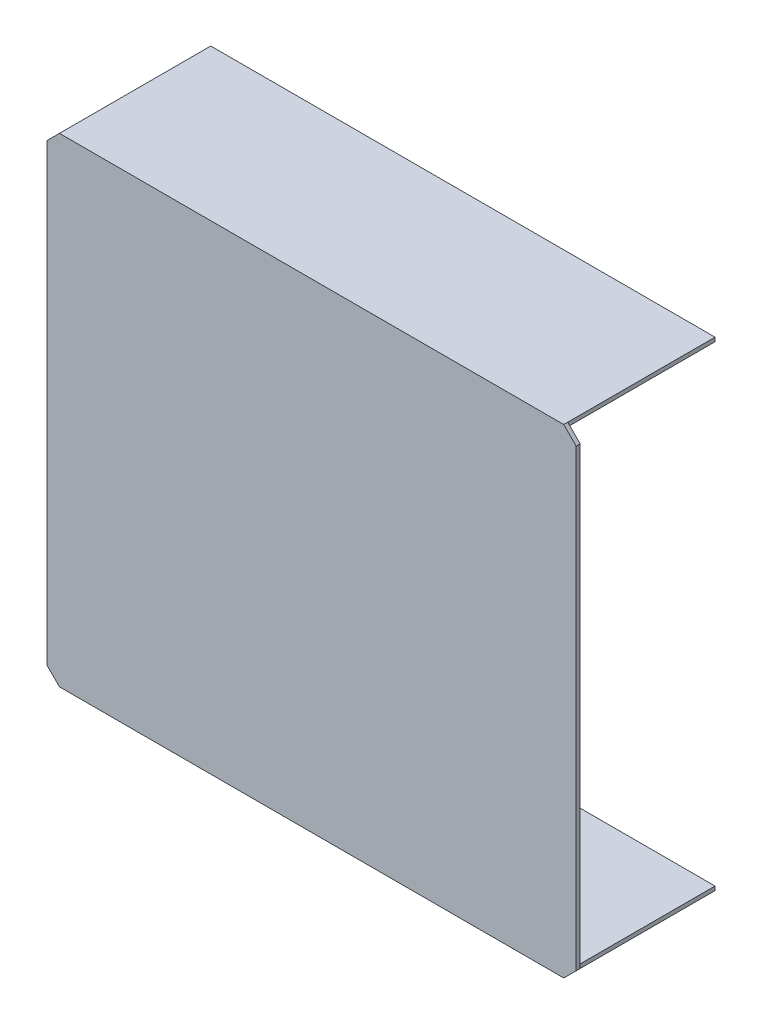
ISO-10303-21;
HEADER;
FILE_DESCRIPTION(('STEP AP214'),'2;1');
FILE_NAME('part.step','',(''),(''),'','','');
FILE_SCHEMA(('AUTOMOTIVE_DESIGN { 1 0 10303 214 1 1 1 1 }'));
ENDSEC;
DATA;
#1=APPLICATION_CONTEXT('core data for automotive mechanical design processes');
#2=APPLICATION_PROTOCOL_DEFINITION('international standard','automotive_design',2000,#1);
#3=PRODUCT_CONTEXT('',#1,'mechanical');
#4=PRODUCT('Part','Part','',(#3));
#5=PRODUCT_RELATED_PRODUCT_CATEGORY('part','',(#4));
#6=PRODUCT_DEFINITION_FORMATION('','',#4);
#7=PRODUCT_DEFINITION_CONTEXT('part definition',#1,'design');
#8=PRODUCT_DEFINITION('design','',#6,#7);
#9=PRODUCT_DEFINITION_SHAPE('','',#8);
#10=(LENGTH_UNIT() NAMED_UNIT(*) SI_UNIT(.MILLI.,.METRE.));
#11=(NAMED_UNIT(*) PLANE_ANGLE_UNIT() SI_UNIT($,.RADIAN.));
#12=(NAMED_UNIT(*) SI_UNIT($,.STERADIAN.) SOLID_ANGLE_UNIT());
#13=UNCERTAINTY_MEASURE_WITH_UNIT(LENGTH_MEASURE(1.E-05),#10,'distance_accuracy_value','');
#14=(GEOMETRIC_REPRESENTATION_CONTEXT(3) GLOBAL_UNCERTAINTY_ASSIGNED_CONTEXT((#13)) GLOBAL_UNIT_ASSIGNED_CONTEXT((#10,
#11,#12)) REPRESENTATION_CONTEXT('',''));
#15=CARTESIAN_POINT('',(0.,0.,0.));
#16=DIRECTION('',(0.,0.,1.));
#17=DIRECTION('',(1.,0.,0.));
#18=AXIS2_PLACEMENT_3D('',#15,#16,#17);
#19=CARTESIAN_POINT('',(-106.,-91.,87.6));
#20=DIRECTION('',(0.707106781186549,0.707106781186547,0.));
#21=DIRECTION('',(-0.707106781186547,0.707106781186549,0.));
#22=AXIS2_PLACEMENT_3D('',#19,#20,#21);
#23=PLANE('',#22);
#24=DIRECTION('',(0.707106781186546,-0.707106781186548,0.));
#25=VECTOR('',#24,1.);
#26=CARTESIAN_POINT('',(-106.,-91.,86.));
#27=LINE('',#26,#25);
#28=CARTESIAN_POINT('',(-106.,-91.,86.));
#29=VERTEX_POINT('',#28);
#30=CARTESIAN_POINT('',(-101.,-96.,86.));
#31=VERTEX_POINT('',#30);
#32=EDGE_CURVE('E141',#29,#31,#27,.T.);
#33=ORIENTED_EDGE('',*,*,#32,.T.);
#34=DIRECTION('',(0.,0.,-1.));
#35=VECTOR('',#34,1.);
#36=CARTESIAN_POINT('',(-101.,-96.,87.6));
#37=LINE('',#36,#35);
#38=CARTESIAN_POINT('',(-101.,-96.,87.6));
#39=VERTEX_POINT('',#38);
#40=EDGE_CURVE('E11',#39,#31,#37,.T.);
#41=ORIENTED_EDGE('',*,*,#40,.F.);
#42=DIRECTION('',(0.707106781186546,-0.707106781186548,0.));
#43=VECTOR('',#42,1.);
#44=CARTESIAN_POINT('',(-106.,-91.,87.6));
#45=LINE('',#44,#43);
#46=CARTESIAN_POINT('',(-106.,-91.,87.6));
#47=VERTEX_POINT('',#46);
#48=EDGE_CURVE('E160',#47,#39,#45,.T.);
#49=ORIENTED_EDGE('',*,*,#48,.F.);
#50=DIRECTION('',(0.,0.,-1.));
#51=VECTOR('',#50,1.);
#52=CARTESIAN_POINT('',(-106.,-91.,87.6));
#53=LINE('',#52,#51);
#54=EDGE_CURVE('E138',#47,#29,#53,.T.);
#55=ORIENTED_EDGE('',*,*,#54,.T.);
#56=EDGE_LOOP('',(#33,#41,#49,#55));
#57=FACE_BOUND('',#56,.T.);
#58=ADVANCED_FACE('F41',(#57),#23,.F.);
#59=CARTESIAN_POINT('',(-101.,-96.,87.6));
#60=DIRECTION('',(0.,1.,0.));
#61=DIRECTION('',(0.,0.,1.));
#62=AXIS2_PLACEMENT_3D('',#59,#60,#61);
#63=PLANE('',#62);
#64=ORIENTED_EDGE('',*,*,#40,.T.);
#65=DIRECTION('',(0.,0.,-1.));
#66=VECTOR('',#65,1.);
#67=CARTESIAN_POINT('',(-101.,-96.,86.));
#68=LINE('',#67,#66);
#69=CARTESIAN_POINT('',(-101.,-96.,27.));
#70=VERTEX_POINT('',#69);
#71=EDGE_CURVE('E225',#31,#70,#68,.T.);
#72=ORIENTED_EDGE('',*,*,#71,.T.);
#73=DIRECTION('',(1.,0.,0.));
#74=VECTOR('',#73,1.);
#75=CARTESIAN_POINT('',(-101.,-96.,27.));
#76=LINE('',#75,#74);
#77=CARTESIAN_POINT('',(101.,-96.,27.));
#78=VERTEX_POINT('',#77);
#79=EDGE_CURVE('E210',#70,#78,#76,.T.);
#80=ORIENTED_EDGE('',*,*,#79,.T.);
#81=DIRECTION('',(0.,0.,-1.));
#82=VECTOR('',#81,1.);
#83=CARTESIAN_POINT('',(101.,-96.,86.));
#84=LINE('',#83,#82);
#85=CARTESIAN_POINT('',(101.,-96.,86.));
#86=VERTEX_POINT('',#85);
#87=EDGE_CURVE('E218',#86,#78,#84,.T.);
#88=ORIENTED_EDGE('',*,*,#87,.F.);
#89=DIRECTION('',(0.,0.,-1.));
#90=VECTOR('',#89,1.);
#91=CARTESIAN_POINT('',(101.,-96.,87.6));
#92=LINE('',#91,#90);
#93=CARTESIAN_POINT('',(101.,-96.,87.6));
#94=VERTEX_POINT('',#93);
#95=EDGE_CURVE('E48',#94,#86,#92,.T.);
#96=ORIENTED_EDGE('',*,*,#95,.F.);
#97=DIRECTION('',(1.,0.,0.));
#98=VECTOR('',#97,1.);
#99=CARTESIAN_POINT('',(-101.,-96.,87.6));
#100=LINE('',#99,#98);
#101=EDGE_CURVE('E96',#39,#94,#100,.T.);
#102=ORIENTED_EDGE('',*,*,#101,.F.);
#103=EDGE_LOOP('',(#64,#72,#80,#88,#96,#102));
#104=FACE_BOUND('',#103,.T.);
#105=ADVANCED_FACE('F292',(#104),#63,.F.);
#106=CARTESIAN_POINT('',(101.,-96.,87.6));
#107=DIRECTION('',(-0.707106781186549,0.707106781186547,0.));
#108=DIRECTION('',(-0.707106781186547,-0.707106781186549,0.));
#109=AXIS2_PLACEMENT_3D('',#106,#107,#108);
#110=PLANE('',#109);
#111=DIRECTION('',(0.707106781186546,0.707106781186548,0.));
#112=VECTOR('',#111,1.);
#113=CARTESIAN_POINT('',(101.,-96.,86.));
#114=LINE('',#113,#112);
#115=CARTESIAN_POINT('',(106.,-91.,86.));
#116=VERTEX_POINT('',#115);
#117=EDGE_CURVE('E148',#86,#116,#114,.T.);
#118=ORIENTED_EDGE('',*,*,#117,.T.);
#119=DIRECTION('',(0.,0.,-1.));
#120=VECTOR('',#119,1.);
#121=CARTESIAN_POINT('',(106.,-91.,87.6));
#122=LINE('',#121,#120);
#123=CARTESIAN_POINT('',(106.,-91.,87.6));
#124=VERTEX_POINT('',#123);
#125=EDGE_CURVE('E163',#124,#116,#122,.T.);
#126=ORIENTED_EDGE('',*,*,#125,.F.);
#127=DIRECTION('',(0.707106781186546,0.707106781186548,0.));
#128=VECTOR('',#127,1.);
#129=CARTESIAN_POINT('',(101.,-96.,87.6));
#130=LINE('',#129,#128);
#131=EDGE_CURVE('E174',#94,#124,#130,.T.);
#132=ORIENTED_EDGE('',*,*,#131,.F.);
#133=ORIENTED_EDGE('',*,*,#95,.T.);
#134=EDGE_LOOP('',(#118,#126,#132,#133));
#135=FACE_BOUND('',#134,.T.);
#136=ADVANCED_FACE('F172',(#135),#110,.F.);
#137=CARTESIAN_POINT('',(106.,-91.,87.6));
#138=DIRECTION('',(-1.,0.,0.));
#139=DIRECTION('',(0.,0.,1.));
#140=AXIS2_PLACEMENT_3D('',#137,#138,#139);
#141=PLANE('',#140);
#142=DIRECTION('',(0.,1.,0.));
#143=VECTOR('',#142,1.);
#144=CARTESIAN_POINT('',(106.,-91.,86.));
#145=LINE('',#144,#143);
#146=CARTESIAN_POINT('',(106.,91.,86.));
#147=VERTEX_POINT('',#146);
#148=EDGE_CURVE('E149',#116,#147,#145,.T.);
#149=ORIENTED_EDGE('',*,*,#148,.T.);
#150=DIRECTION('',(0.,0.,-1.));
#151=VECTOR('',#150,1.);
#152=CARTESIAN_POINT('',(106.,91.,87.6));
#153=LINE('',#152,#151);
#154=CARTESIAN_POINT('',(106.,91.,87.6));
#155=VERTEX_POINT('',#154);
#156=EDGE_CURVE('E161',#155,#147,#153,.T.);
#157=ORIENTED_EDGE('',*,*,#156,.F.);
#158=DIRECTION('',(0.,1.,0.));
#159=VECTOR('',#158,1.);
#160=CARTESIAN_POINT('',(106.,-91.,87.6));
#161=LINE('',#160,#159);
#162=EDGE_CURVE('E191',#124,#155,#161,.T.);
#163=ORIENTED_EDGE('',*,*,#162,.F.);
#164=ORIENTED_EDGE('',*,*,#125,.T.);
#165=EDGE_LOOP('',(#149,#157,#163,#164));
#166=FACE_BOUND('',#165,.T.);
#167=ADVANCED_FACE('F190',(#166),#141,.F.);
#168=CARTESIAN_POINT('',(106.,91.,87.6));
#169=DIRECTION('',(-0.707106781186549,-0.707106781186547,0.));
#170=DIRECTION('',(0.707106781186547,-0.707106781186549,0.));
#171=AXIS2_PLACEMENT_3D('',#168,#169,#170);
#172=PLANE('',#171);
#173=DIRECTION('',(-0.707106781186546,0.707106781186548,0.));
#174=VECTOR('',#173,1.);
#175=CARTESIAN_POINT('',(106.,91.,86.));
#176=LINE('',#175,#174);
#177=CARTESIAN_POINT('',(101.,96.,86.));
#178=VERTEX_POINT('',#177);
#179=EDGE_CURVE('E151',#147,#178,#176,.T.);
#180=ORIENTED_EDGE('',*,*,#179,.T.);
#181=DIRECTION('',(0.,0.,-1.));
#182=VECTOR('',#181,1.);
#183=CARTESIAN_POINT('',(101.,96.,87.6));
#184=LINE('',#183,#182);
#185=CARTESIAN_POINT('',(101.,96.,87.6));
#186=VERTEX_POINT('',#185);
#187=EDGE_CURVE('E131',#186,#178,#184,.T.);
#188=ORIENTED_EDGE('',*,*,#187,.F.);
#189=DIRECTION('',(-0.707106781186546,0.707106781186548,0.));
#190=VECTOR('',#189,1.);
#191=CARTESIAN_POINT('',(106.,91.,87.6));
#192=LINE('',#191,#190);
#193=EDGE_CURVE('E116',#155,#186,#192,.T.);
#194=ORIENTED_EDGE('',*,*,#193,.F.);
#195=ORIENTED_EDGE('',*,*,#156,.T.);
#196=EDGE_LOOP('',(#180,#188,#194,#195));
#197=FACE_BOUND('',#196,.T.);
#198=ADVANCED_FACE('F188',(#197),#172,.F.);
#199=CARTESIAN_POINT('',(101.,96.,87.6));
#200=DIRECTION('',(0.,-1.,0.));
#201=DIRECTION('',(0.,0.,-1.));
#202=AXIS2_PLACEMENT_3D('',#199,#200,#201);
#203=PLANE('',#202);
#204=ORIENTED_EDGE('',*,*,#187,.T.);
#205=DIRECTION('',(0.,0.,-1.));
#206=VECTOR('',#205,1.);
#207=CARTESIAN_POINT('',(101.,96.,86.));
#208=LINE('',#207,#206);
#209=CARTESIAN_POINT('',(101.,96.,27.));
#210=VERTEX_POINT('',#209);
#211=EDGE_CURVE('E228',#178,#210,#208,.T.);
#212=ORIENTED_EDGE('',*,*,#211,.T.);
#213=DIRECTION('',(-1.,0.,0.));
#214=VECTOR('',#213,1.);
#215=CARTESIAN_POINT('',(101.,96.,27.));
#216=LINE('',#215,#214);
#217=CARTESIAN_POINT('',(-101.,96.,27.));
#218=VERTEX_POINT('',#217);
#219=EDGE_CURVE('E235',#210,#218,#216,.T.);
#220=ORIENTED_EDGE('',*,*,#219,.T.);
#221=DIRECTION('',(0.,0.,-1.));
#222=VECTOR('',#221,1.);
#223=CARTESIAN_POINT('',(-101.,96.,86.));
#224=LINE('',#223,#222);
#225=CARTESIAN_POINT('',(-101.,96.,86.));
#226=VERTEX_POINT('',#225);
#227=EDGE_CURVE('E128',#226,#218,#224,.T.);
#228=ORIENTED_EDGE('',*,*,#227,.F.);
#229=DIRECTION('',(0.,0.,-1.));
#230=VECTOR('',#229,1.);
#231=CARTESIAN_POINT('',(-101.,96.,87.6));
#232=LINE('',#231,#230);
#233=CARTESIAN_POINT('',(-101.,96.,87.6));
#234=VERTEX_POINT('',#233);
#235=EDGE_CURVE('E127',#234,#226,#232,.T.);
#236=ORIENTED_EDGE('',*,*,#235,.F.);
#237=DIRECTION('',(-1.,0.,0.));
#238=VECTOR('',#237,1.);
#239=CARTESIAN_POINT('',(101.,96.,87.6));
#240=LINE('',#239,#238);
#241=EDGE_CURVE('E115',#186,#234,#240,.T.);
#242=ORIENTED_EDGE('',*,*,#241,.F.);
#243=EDGE_LOOP('',(#204,#212,#220,#228,#236,#242));
#244=FACE_BOUND('',#243,.T.);
#245=ADVANCED_FACE('F130',(#244),#203,.F.);
#246=CARTESIAN_POINT('',(-101.,96.,87.6));
#247=DIRECTION('',(0.707106781186549,-0.707106781186547,0.));
#248=DIRECTION('',(0.707106781186547,0.707106781186549,0.));
#249=AXIS2_PLACEMENT_3D('',#246,#247,#248);
#250=PLANE('',#249);
#251=DIRECTION('',(-0.707106781186546,-0.707106781186548,0.));
#252=VECTOR('',#251,1.);
#253=CARTESIAN_POINT('',(-101.,96.,86.));
#254=LINE('',#253,#252);
#255=CARTESIAN_POINT('',(-106.,91.,86.));
#256=VERTEX_POINT('',#255);
#257=EDGE_CURVE('E152',#226,#256,#254,.T.);
#258=ORIENTED_EDGE('',*,*,#257,.T.);
#259=DIRECTION('',(0.,0.,-1.));
#260=VECTOR('',#259,1.);
#261=CARTESIAN_POINT('',(-106.,91.,87.6));
#262=LINE('',#261,#260);
#263=CARTESIAN_POINT('',(-106.,91.,87.6));
#264=VERTEX_POINT('',#263);
#265=EDGE_CURVE('E133',#264,#256,#262,.T.);
#266=ORIENTED_EDGE('',*,*,#265,.F.);
#267=DIRECTION('',(-0.707106781186546,-0.707106781186548,0.));
#268=VECTOR('',#267,1.);
#269=CARTESIAN_POINT('',(-101.,96.,87.6));
#270=LINE('',#269,#268);
#271=EDGE_CURVE('E117',#234,#264,#270,.T.);
#272=ORIENTED_EDGE('',*,*,#271,.F.);
#273=ORIENTED_EDGE('',*,*,#235,.T.);
#274=EDGE_LOOP('',(#258,#266,#272,#273));
#275=FACE_BOUND('',#274,.T.);
#276=ADVANCED_FACE('F137',(#275),#250,.F.);
#277=CARTESIAN_POINT('',(-106.,91.,87.6));
#278=DIRECTION('',(1.,0.,0.));
#279=DIRECTION('',(0.,0.,-1.));
#280=AXIS2_PLACEMENT_3D('',#277,#278,#279);
#281=PLANE('',#280);
#282=DIRECTION('',(0.,-1.,0.));
#283=VECTOR('',#282,1.);
#284=CARTESIAN_POINT('',(-106.,91.,86.));
#285=LINE('',#284,#283);
#286=EDGE_CURVE('E86',#256,#29,#285,.T.);
#287=ORIENTED_EDGE('',*,*,#286,.T.);
#288=ORIENTED_EDGE('',*,*,#54,.F.);
#289=DIRECTION('',(0.,-1.,0.));
#290=VECTOR('',#289,1.);
#291=CARTESIAN_POINT('',(-106.,91.,87.6));
#292=LINE('',#291,#290);
#293=EDGE_CURVE('E61',#264,#47,#292,.T.);
#294=ORIENTED_EDGE('',*,*,#293,.F.);
#295=ORIENTED_EDGE('',*,*,#265,.T.);
#296=EDGE_LOOP('',(#287,#288,#294,#295));
#297=FACE_BOUND('',#296,.T.);
#298=ADVANCED_FACE('F294',(#297),#281,.F.);
#299=CARTESIAN_POINT('',(0.,0.,87.6));
#300=DIRECTION('',(0.,0.,1.));
#301=DIRECTION('',(1.,0.,0.));
#302=AXIS2_PLACEMENT_3D('',#299,#300,#301);
#303=PLANE('',#302);
#304=ORIENTED_EDGE('',*,*,#48,.T.);
#305=ORIENTED_EDGE('',*,*,#101,.T.);
#306=ORIENTED_EDGE('',*,*,#131,.T.);
#307=ORIENTED_EDGE('',*,*,#162,.T.);
#308=ORIENTED_EDGE('',*,*,#193,.T.);
#309=ORIENTED_EDGE('',*,*,#241,.T.);
#310=ORIENTED_EDGE('',*,*,#271,.T.);
#311=ORIENTED_EDGE('',*,*,#293,.T.);
#312=EDGE_LOOP('',(#304,#305,#306,#307,#308,#309,#310,#311));
#313=FACE_BOUND('',#312,.T.);
#314=ADVANCED_FACE('F111',(#313),#303,.T.);
#315=CARTESIAN_POINT('',(0.,0.,86.));
#316=DIRECTION('',(0.,0.,1.));
#317=DIRECTION('',(1.,0.,0.));
#318=AXIS2_PLACEMENT_3D('',#315,#316,#317);
#319=PLANE('',#318);
#320=ORIENTED_EDGE('',*,*,#257,.F.);
#321=DIRECTION('',(0.,-1.,0.));
#322=VECTOR('',#321,1.);
#323=CARTESIAN_POINT('',(-101.,96.,86.));
#324=LINE('',#323,#322);
#325=CARTESIAN_POINT('',(-101.,94.4,86.));
#326=VERTEX_POINT('',#325);
#327=EDGE_CURVE('E240',#226,#326,#324,.T.);
#328=ORIENTED_EDGE('',*,*,#327,.T.);
#329=DIRECTION('',(1.,0.,0.));
#330=VECTOR('',#329,1.);
#331=CARTESIAN_POINT('',(-101.,94.4,86.));
#332=LINE('',#331,#330);
#333=CARTESIAN_POINT('',(101.,94.4,86.));
#334=VERTEX_POINT('',#333);
#335=EDGE_CURVE('E247',#326,#334,#332,.T.);
#336=ORIENTED_EDGE('',*,*,#335,.T.);
#337=DIRECTION('',(0.,1.,0.));
#338=VECTOR('',#337,1.);
#339=CARTESIAN_POINT('',(101.,94.4,86.));
#340=LINE('',#339,#338);
#341=EDGE_CURVE('E233',#334,#178,#340,.T.);
#342=ORIENTED_EDGE('',*,*,#341,.T.);
#343=ORIENTED_EDGE('',*,*,#179,.F.);
#344=ORIENTED_EDGE('',*,*,#148,.F.);
#345=ORIENTED_EDGE('',*,*,#117,.F.);
#346=DIRECTION('',(0.,1.,0.));
#347=VECTOR('',#346,1.);
#348=CARTESIAN_POINT('',(101.,-96.,86.));
#349=LINE('',#348,#347);
#350=CARTESIAN_POINT('',(101.,-94.4,86.));
#351=VERTEX_POINT('',#350);
#352=EDGE_CURVE('E185',#86,#351,#349,.T.);
#353=ORIENTED_EDGE('',*,*,#352,.T.);
#354=DIRECTION('',(-1.,0.,0.));
#355=VECTOR('',#354,1.);
#356=CARTESIAN_POINT('',(101.,-94.4,86.));
#357=LINE('',#356,#355);
#358=CARTESIAN_POINT('',(-101.,-94.4,86.));
#359=VERTEX_POINT('',#358);
#360=EDGE_CURVE('E199',#351,#359,#357,.T.);
#361=ORIENTED_EDGE('',*,*,#360,.T.);
#362=DIRECTION('',(0.,-1.,0.));
#363=VECTOR('',#362,1.);
#364=CARTESIAN_POINT('',(-101.,-94.4,86.));
#365=LINE('',#364,#363);
#366=EDGE_CURVE('E54',#359,#31,#365,.T.);
#367=ORIENTED_EDGE('',*,*,#366,.T.);
#368=ORIENTED_EDGE('',*,*,#32,.F.);
#369=ORIENTED_EDGE('',*,*,#286,.F.);
#370=EDGE_LOOP('',(#320,#328,#336,#342,#343,#344,#345,#353,#361,#367,#368,#369));
#371=FACE_BOUND('',#370,.T.);
#372=ADVANCED_FACE('F178',(#371),#319,.F.);
#373=CARTESIAN_POINT('',(-101.,-94.4,86.));
#374=DIRECTION('',(1.,0.,0.));
#375=DIRECTION('',(0.,0.,-1.));
#376=AXIS2_PLACEMENT_3D('',#373,#374,#375);
#377=PLANE('',#376);
#378=DIRECTION('',(0.,-1.,0.));
#379=VECTOR('',#378,1.);
#380=CARTESIAN_POINT('',(-101.,-94.4,27.));
#381=LINE('',#380,#379);
#382=CARTESIAN_POINT('',(-101.,-94.4,27.));
#383=VERTEX_POINT('',#382);
#384=EDGE_CURVE('E201',#383,#70,#381,.T.);
#385=ORIENTED_EDGE('',*,*,#384,.T.);
#386=ORIENTED_EDGE('',*,*,#71,.F.);
#387=ORIENTED_EDGE('',*,*,#366,.F.);
#388=DIRECTION('',(0.,0.,-1.));
#389=VECTOR('',#388,1.);
#390=CARTESIAN_POINT('',(-101.,-94.4,86.));
#391=LINE('',#390,#389);
#392=EDGE_CURVE('E205',#359,#383,#391,.T.);
#393=ORIENTED_EDGE('',*,*,#392,.T.);
#394=EDGE_LOOP('',(#385,#386,#387,#393));
#395=FACE_BOUND('',#394,.T.);
#396=ADVANCED_FACE('F333',(#395),#377,.F.);
#397=CARTESIAN_POINT('',(101.,-96.,86.));
#398=DIRECTION('',(-1.,0.,0.));
#399=DIRECTION('',(0.,0.,1.));
#400=AXIS2_PLACEMENT_3D('',#397,#398,#399);
#401=PLANE('',#400);
#402=DIRECTION('',(0.,1.,0.));
#403=VECTOR('',#402,1.);
#404=CARTESIAN_POINT('',(101.,-96.,27.));
#405=LINE('',#404,#403);
#406=CARTESIAN_POINT('',(101.,-94.4,27.));
#407=VERTEX_POINT('',#406);
#408=EDGE_CURVE('E209',#78,#407,#405,.T.);
#409=ORIENTED_EDGE('',*,*,#408,.T.);
#410=DIRECTION('',(0.,0.,-1.));
#411=VECTOR('',#410,1.);
#412=CARTESIAN_POINT('',(101.,-94.4,86.));
#413=LINE('',#412,#411);
#414=EDGE_CURVE('E216',#351,#407,#413,.T.);
#415=ORIENTED_EDGE('',*,*,#414,.F.);
#416=ORIENTED_EDGE('',*,*,#352,.F.);
#417=ORIENTED_EDGE('',*,*,#87,.T.);
#418=EDGE_LOOP('',(#409,#415,#416,#417));
#419=FACE_BOUND('',#418,.T.);
#420=ADVANCED_FACE('F281',(#419),#401,.F.);
#421=CARTESIAN_POINT('',(101.,-94.4,86.));
#422=DIRECTION('',(0.,-1.,0.));
#423=DIRECTION('',(0.,0.,-1.));
#424=AXIS2_PLACEMENT_3D('',#421,#422,#423);
#425=PLANE('',#424);
#426=DIRECTION('',(-1.,0.,0.));
#427=VECTOR('',#426,1.);
#428=CARTESIAN_POINT('',(101.,-94.4,27.));
#429=LINE('',#428,#427);
#430=EDGE_CURVE('E196',#407,#383,#429,.T.);
#431=ORIENTED_EDGE('',*,*,#430,.T.);
#432=ORIENTED_EDGE('',*,*,#392,.F.);
#433=ORIENTED_EDGE('',*,*,#360,.F.);
#434=ORIENTED_EDGE('',*,*,#414,.T.);
#435=EDGE_LOOP('',(#431,#432,#433,#434));
#436=FACE_BOUND('',#435,.T.);
#437=ADVANCED_FACE('F289',(#436),#425,.F.);
#438=CARTESIAN_POINT('',(0.,0.,27.));
#439=DIRECTION('',(0.,0.,1.));
#440=DIRECTION('',(1.,0.,0.));
#441=AXIS2_PLACEMENT_3D('',#438,#439,#440);
#442=PLANE('',#441);
#443=ORIENTED_EDGE('',*,*,#384,.F.);
#444=ORIENTED_EDGE('',*,*,#430,.F.);
#445=ORIENTED_EDGE('',*,*,#408,.F.);
#446=ORIENTED_EDGE('',*,*,#79,.F.);
#447=EDGE_LOOP('',(#443,#444,#445,#446));
#448=FACE_BOUND('',#447,.T.);
#449=ADVANCED_FACE('F356',(#448),#442,.F.);
#450=CARTESIAN_POINT('',(-101.,96.,86.));
#451=DIRECTION('',(1.,0.,0.));
#452=DIRECTION('',(0.,0.,-1.));
#453=AXIS2_PLACEMENT_3D('',#450,#451,#452);
#454=PLANE('',#453);
#455=DIRECTION('',(0.,-1.,0.));
#456=VECTOR('',#455,1.);
#457=CARTESIAN_POINT('',(-101.,96.,27.));
#458=LINE('',#457,#456);
#459=CARTESIAN_POINT('',(-101.,94.4,27.));
#460=VERTEX_POINT('',#459);
#461=EDGE_CURVE('E206',#218,#460,#458,.T.);
#462=ORIENTED_EDGE('',*,*,#461,.T.);
#463=DIRECTION('',(0.,0.,-1.));
#464=VECTOR('',#463,1.);
#465=CARTESIAN_POINT('',(-101.,94.4,86.));
#466=LINE('',#465,#464);
#467=EDGE_CURVE('E150',#326,#460,#466,.T.);
#468=ORIENTED_EDGE('',*,*,#467,.F.);
#469=ORIENTED_EDGE('',*,*,#327,.F.);
#470=ORIENTED_EDGE('',*,*,#227,.T.);
#471=EDGE_LOOP('',(#462,#468,#469,#470));
#472=FACE_BOUND('',#471,.T.);
#473=ADVANCED_FACE('F256',(#472),#454,.F.);
#474=CARTESIAN_POINT('',(-101.,94.4,86.));
#475=DIRECTION('',(0.,1.,0.));
#476=DIRECTION('',(0.,0.,1.));
#477=AXIS2_PLACEMENT_3D('',#474,#475,#476);
#478=PLANE('',#477);
#479=DIRECTION('',(1.,0.,0.));
#480=VECTOR('',#479,1.);
#481=CARTESIAN_POINT('',(-101.,94.4,27.));
#482=LINE('',#481,#480);
#483=CARTESIAN_POINT('',(101.,94.4,27.));
#484=VERTEX_POINT('',#483);
#485=EDGE_CURVE('E242',#460,#484,#482,.T.);
#486=ORIENTED_EDGE('',*,*,#485,.T.);
#487=DIRECTION('',(0.,0.,-1.));
#488=VECTOR('',#487,1.);
#489=CARTESIAN_POINT('',(101.,94.4,86.));
#490=LINE('',#489,#488);
#491=EDGE_CURVE('E230',#334,#484,#490,.T.);
#492=ORIENTED_EDGE('',*,*,#491,.F.);
#493=ORIENTED_EDGE('',*,*,#335,.F.);
#494=ORIENTED_EDGE('',*,*,#467,.T.);
#495=EDGE_LOOP('',(#486,#492,#493,#494));
#496=FACE_BOUND('',#495,.T.);
#497=ADVANCED_FACE('F375',(#496),#478,.F.);
#498=CARTESIAN_POINT('',(101.,94.4,86.));
#499=DIRECTION('',(-1.,0.,0.));
#500=DIRECTION('',(0.,0.,1.));
#501=AXIS2_PLACEMENT_3D('',#498,#499,#500);
#502=PLANE('',#501);
#503=DIRECTION('',(0.,1.,0.));
#504=VECTOR('',#503,1.);
#505=CARTESIAN_POINT('',(101.,94.4,27.));
#506=LINE('',#505,#504);
#507=EDGE_CURVE('E236',#484,#210,#506,.T.);
#508=ORIENTED_EDGE('',*,*,#507,.T.);
#509=ORIENTED_EDGE('',*,*,#211,.F.);
#510=ORIENTED_EDGE('',*,*,#341,.F.);
#511=ORIENTED_EDGE('',*,*,#491,.T.);
#512=EDGE_LOOP('',(#508,#509,#510,#511));
#513=FACE_BOUND('',#512,.T.);
#514=ADVANCED_FACE('F379',(#513),#502,.F.);
#515=CARTESIAN_POINT('',(0.,0.,27.));
#516=DIRECTION('',(0.,0.,1.));
#517=DIRECTION('',(1.,0.,0.));
#518=AXIS2_PLACEMENT_3D('',#515,#516,#517);
#519=PLANE('',#518);
#520=ORIENTED_EDGE('',*,*,#461,.F.);
#521=ORIENTED_EDGE('',*,*,#219,.F.);
#522=ORIENTED_EDGE('',*,*,#507,.F.);
#523=ORIENTED_EDGE('',*,*,#485,.F.);
#524=EDGE_LOOP('',(#520,#521,#522,#523));
#525=FACE_BOUND('',#524,.T.);
#526=ADVANCED_FACE('F386',(#525),#519,.F.);
#527=CLOSED_SHELL('',(#58,#105,#136,#167,#198,#245,#276,#298,#314,#372,#396,#420,#437,#449,#473,
#497,#514,#526));
#528=MANIFOLD_SOLID_BREP('B2',#527);
#529=ADVANCED_BREP_SHAPE_REPRESENTATION('',(#18,#528),#14);
#530=SHAPE_DEFINITION_REPRESENTATION(#9,#529);
ENDSEC;
END-ISO-10303-21;
